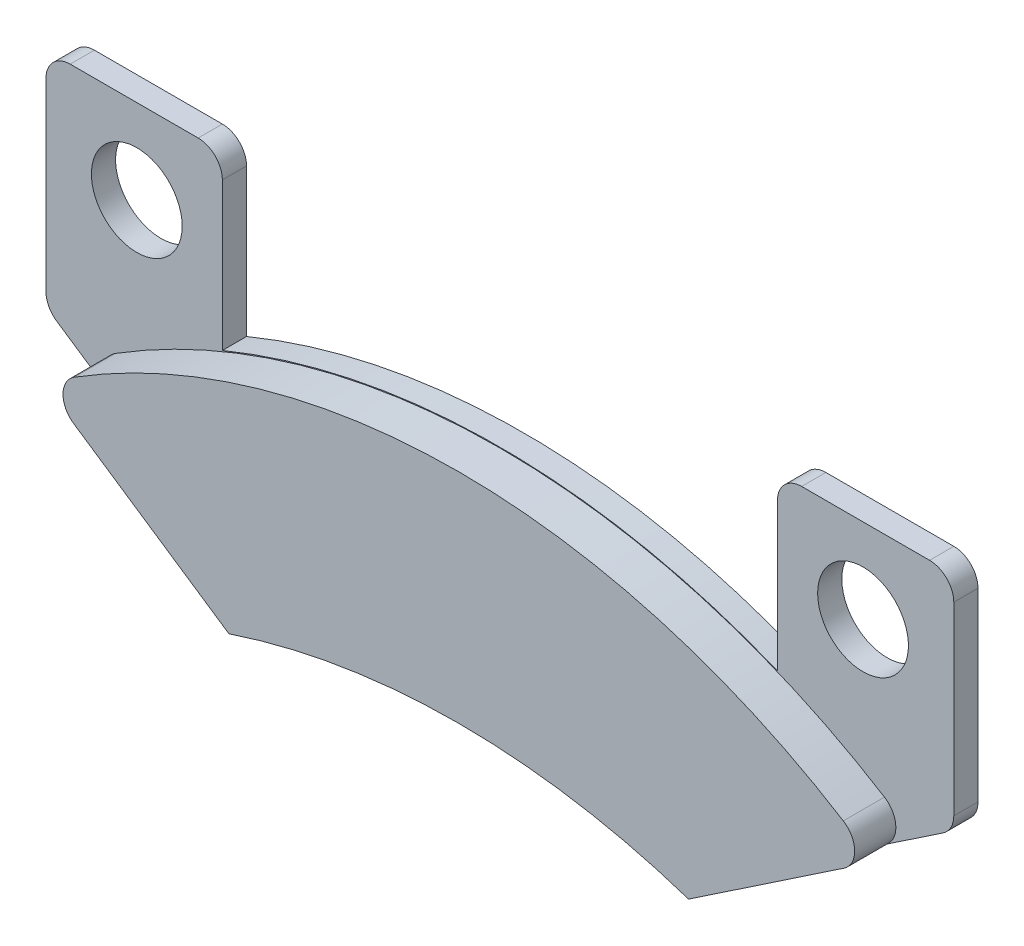
ISO-10303-21;
HEADER;
FILE_DESCRIPTION(('STEP AP214'),'2;1');
FILE_NAME('part.step','',(''),(''),'','','');
FILE_SCHEMA(('AUTOMOTIVE_DESIGN { 1 0 10303 214 1 1 1 1 }'));
ENDSEC;
DATA;
#1=APPLICATION_CONTEXT('core data for automotive mechanical design processes');
#2=APPLICATION_PROTOCOL_DEFINITION('international standard','automotive_design',2000,#1);
#3=PRODUCT_CONTEXT('',#1,'mechanical');
#4=PRODUCT('Part','Part','',(#3));
#5=PRODUCT_RELATED_PRODUCT_CATEGORY('part','',(#4));
#6=PRODUCT_DEFINITION_FORMATION('','',#4);
#7=PRODUCT_DEFINITION_CONTEXT('part definition',#1,'design');
#8=PRODUCT_DEFINITION('design','',#6,#7);
#9=PRODUCT_DEFINITION_SHAPE('','',#8);
#10=(LENGTH_UNIT() NAMED_UNIT(*) SI_UNIT(.MILLI.,.METRE.));
#11=(NAMED_UNIT(*) PLANE_ANGLE_UNIT() SI_UNIT($,.RADIAN.));
#12=(NAMED_UNIT(*) SI_UNIT($,.STERADIAN.) SOLID_ANGLE_UNIT());
#13=UNCERTAINTY_MEASURE_WITH_UNIT(LENGTH_MEASURE(1.E-05),#10,'distance_accuracy_value','');
#14=(GEOMETRIC_REPRESENTATION_CONTEXT(3) GLOBAL_UNCERTAINTY_ASSIGNED_CONTEXT((#13)) GLOBAL_UNIT_ASSIGNED_CONTEXT((#10,
#11,#12)) REPRESENTATION_CONTEXT('',''));
#15=CARTESIAN_POINT('',(0.,0.,0.));
#16=DIRECTION('',(0.,0.,1.));
#17=DIRECTION('',(1.,0.,0.));
#18=AXIS2_PLACEMENT_3D('',#15,#16,#17);
#19=CARTESIAN_POINT('',(0.,-94.4927219946583,2.54));
#20=DIRECTION('',(0.,0.,-1.));
#21=DIRECTION('',(-1.,0.,0.));
#22=AXIS2_PLACEMENT_3D('',#19,#20,#21);
#23=PLANE('',#22);
#24=DIRECTION('',(0.,-1.,0.));
#25=VECTOR('',#24,1.);
#26=CARTESIAN_POINT('',(-47.625,16.9068306510464,2.54));
#27=LINE('',#26,#25);
#28=CARTESIAN_POINT('',(-47.625,14.3668306510464,2.54));
#29=VERTEX_POINT('',#28);
#30=CARTESIAN_POINT('',(-47.625,-5.04907037389531,2.54));
#31=VERTEX_POINT('',#30);
#32=EDGE_CURVE('E247',#29,#31,#27,.T.);
#33=ORIENTED_EDGE('',*,*,#32,.T.);
#34=CARTESIAN_POINT('',(-45.085,-5.0490703738953,2.54));
#35=DIRECTION('',(0.,0.,-1.));
#36=DIRECTION('',(-1.,0.,0.));
#37=AXIS2_PLACEMENT_3D('',#34,#35,#36);
#38=CIRCLE('',#37,2.54);
#39=CARTESIAN_POINT('',(-46.5022287831688,-7.15692771635418,2.54));
#40=VERTEX_POINT('',#39);
#41=EDGE_CURVE('E326',#31,#40,#38,.F.);
#42=ORIENTED_EDGE('',*,*,#41,.T.);
#43=DIRECTION('',(0.829865095456248,-0.557964087861748,0.));
#44=VECTOR('',#43,1.);
#45=CARTESIAN_POINT('',(-47.625,-6.40202668327458,2.54));
#46=LINE('',#45,#44);
#47=CARTESIAN_POINT('',(-40.3987612097138,-11.2606256981861,2.54));
#48=VERTEX_POINT('',#47);
#49=EDGE_CURVE('E253',#40,#48,#46,.T.);
#50=ORIENTED_EDGE('',*,*,#49,.T.);
#51=CARTESIAN_POINT('',(-38.981532426545,-9.15276835572724,2.54));
#52=DIRECTION('',(0.,0.,-1.));
#53=DIRECTION('',(-1.,0.,0.));
#54=AXIS2_PLACEMENT_3D('',#51,#52,#53);
#55=CIRCLE('',#54,2.54);
#56=CARTESIAN_POINT('',(-40.3274691857839,-6.99868984273626,2.54));
#57=VERTEX_POINT('',#56);
#58=EDGE_CURVE('E52',#48,#57,#55,.T.);
#59=ORIENTED_EDGE('',*,*,#58,.T.);
#60=CARTESIAN_POINT('',(0.0262918410412195,-71.582087947867,2.54));
#61=DIRECTION('',(0.,0.,1.));
#62=DIRECTION('',(1.,0.,0.));
#63=AXIS2_PLACEMENT_3D('',#60,#61,#62);
#64=CIRCLE('',#63,76.1540631865163);
#65=CARTESIAN_POINT('',(40.3518507919903,-6.98107684812148,2.54));
#66=VERTEX_POINT('',#65);
#67=EDGE_CURVE('E217',#66,#57,#64,.T.);
#68=ORIENTED_EDGE('',*,*,#67,.F.);
#69=CARTESIAN_POINT('',(39.0068546690055,-9.13574281507682,2.54));
#70=DIRECTION('',(0.,0.,-1.));
#71=DIRECTION('',(-1.,0.,0.));
#72=AXIS2_PLACEMENT_3D('',#69,#70,#71);
#73=CIRCLE('',#72,2.54);
#74=CARTESIAN_POINT('',(40.4240834521743,-11.2436001575357,2.54));
#75=VERTEX_POINT('',#74);
#76=EDGE_CURVE('E11',#66,#75,#73,.T.);
#77=ORIENTED_EDGE('',*,*,#76,.T.);
#78=DIRECTION('',(0.829865095456248,0.557964087861748,0.));
#79=VECTOR('',#78,1.);
#80=CARTESIAN_POINT('',(47.625,-6.40202668327458,2.54));
#81=LINE('',#80,#79);
#82=CARTESIAN_POINT('',(46.5022287831688,-7.15692771635418,2.54));
#83=VERTEX_POINT('',#82);
#84=EDGE_CURVE('E251',#75,#83,#81,.T.);
#85=ORIENTED_EDGE('',*,*,#84,.T.);
#86=CARTESIAN_POINT('',(45.085,-5.04907037389531,2.54));
#87=DIRECTION('',(0.,0.,-1.));
#88=DIRECTION('',(-1.,0.,0.));
#89=AXIS2_PLACEMENT_3D('',#86,#87,#88);
#90=CIRCLE('',#89,2.54);
#91=CARTESIAN_POINT('',(47.625,-5.04907037389531,2.54));
#92=VERTEX_POINT('',#91);
#93=EDGE_CURVE('E321',#83,#92,#90,.F.);
#94=ORIENTED_EDGE('',*,*,#93,.T.);
#95=DIRECTION('',(0.,1.,0.));
#96=VECTOR('',#95,1.);
#97=CARTESIAN_POINT('',(47.625,16.9068306510464,2.54));
#98=LINE('',#97,#96);
#99=CARTESIAN_POINT('',(47.625,14.3668306510464,2.54));
#100=VERTEX_POINT('',#99);
#101=EDGE_CURVE('E232',#92,#100,#98,.T.);
#102=ORIENTED_EDGE('',*,*,#101,.T.);
#103=CARTESIAN_POINT('',(45.085,14.3668306510464,2.54));
#104=DIRECTION('',(0.,0.,-1.));
#105=DIRECTION('',(-1.,0.,0.));
#106=AXIS2_PLACEMENT_3D('',#103,#104,#105);
#107=CIRCLE('',#106,2.54);
#108=CARTESIAN_POINT('',(45.085,16.9068306510464,2.54));
#109=VERTEX_POINT('',#108);
#110=EDGE_CURVE('E320',#100,#109,#107,.F.);
#111=ORIENTED_EDGE('',*,*,#110,.T.);
#112=DIRECTION('',(-1.,0.,0.));
#113=VECTOR('',#112,1.);
#114=CARTESIAN_POINT('',(29.1207087068053,16.9068306510464,2.54));
#115=LINE('',#114,#113);
#116=CARTESIAN_POINT('',(31.6607087068053,16.9068306510464,2.54));
#117=VERTEX_POINT('',#116);
#118=EDGE_CURVE('E237',#109,#117,#115,.T.);
#119=ORIENTED_EDGE('',*,*,#118,.T.);
#120=CARTESIAN_POINT('',(31.6607087068053,14.3668306510464,2.54));
#121=DIRECTION('',(0.,0.,-1.));
#122=DIRECTION('',(-1.,0.,0.));
#123=AXIS2_PLACEMENT_3D('',#120,#121,#122);
#124=CIRCLE('',#123,2.54);
#125=CARTESIAN_POINT('',(29.1207087068053,14.3668306510464,2.54));
#126=VERTEX_POINT('',#125);
#127=EDGE_CURVE('E317',#117,#126,#124,.F.);
#128=ORIENTED_EDGE('',*,*,#127,.T.);
#129=DIRECTION('',(0.,-1.,0.));
#130=VECTOR('',#129,1.);
#131=CARTESIAN_POINT('',(29.1207087068053,-1.12833924845038,2.54));
#132=LINE('',#131,#130);
#133=CARTESIAN_POINT('',(29.1207087068053,-1.12833924845038,2.54));
#134=VERTEX_POINT('',#133);
#135=EDGE_CURVE('E238',#126,#134,#132,.T.);
#136=ORIENTED_EDGE('',*,*,#135,.T.);
#137=CARTESIAN_POINT('',(0.,-71.5444192615652,2.54));
#138=DIRECTION('',(0.,0.,1.));
#139=DIRECTION('',(1.,0.,0.));
#140=AXIS2_PLACEMENT_3D('',#137,#138,#139);
#141=CIRCLE('',#140,76.2);
#142=CARTESIAN_POINT('',(-29.1207087068053,-1.12833924845038,2.54));
#143=VERTEX_POINT('',#142);
#144=EDGE_CURVE('E245',#134,#143,#141,.T.);
#145=ORIENTED_EDGE('',*,*,#144,.T.);
#146=DIRECTION('',(0.,1.,0.));
#147=VECTOR('',#146,1.);
#148=CARTESIAN_POINT('',(-29.1207087068053,-1.12833924845038,2.54));
#149=LINE('',#148,#147);
#150=CARTESIAN_POINT('',(-29.1207087068053,14.3668306510464,2.54));
#151=VERTEX_POINT('',#150);
#152=EDGE_CURVE('E243',#143,#151,#149,.T.);
#153=ORIENTED_EDGE('',*,*,#152,.T.);
#154=CARTESIAN_POINT('',(-31.6607087068053,14.3668306510464,2.54));
#155=DIRECTION('',(0.,0.,-1.));
#156=DIRECTION('',(-1.,0.,0.));
#157=AXIS2_PLACEMENT_3D('',#154,#155,#156);
#158=CIRCLE('',#157,2.54);
#159=CARTESIAN_POINT('',(-31.6607087068053,16.9068306510464,2.54));
#160=VERTEX_POINT('',#159);
#161=EDGE_CURVE('E69',#151,#160,#158,.F.);
#162=ORIENTED_EDGE('',*,*,#161,.T.);
#163=DIRECTION('',(-1.,0.,0.));
#164=VECTOR('',#163,1.);
#165=CARTESIAN_POINT('',(-29.1207087068053,16.9068306510464,2.54));
#166=LINE('',#165,#164);
#167=CARTESIAN_POINT('',(-45.085,16.9068306510464,2.54));
#168=VERTEX_POINT('',#167);
#169=EDGE_CURVE('E248',#160,#168,#166,.T.);
#170=ORIENTED_EDGE('',*,*,#169,.T.);
#171=CARTESIAN_POINT('',(-45.085,14.3668306510464,2.54));
#172=DIRECTION('',(0.,0.,-1.));
#173=DIRECTION('',(-1.,0.,0.));
#174=AXIS2_PLACEMENT_3D('',#171,#172,#173);
#175=CIRCLE('',#174,2.54);
#176=EDGE_CURVE('E322',#168,#29,#175,.F.);
#177=ORIENTED_EDGE('',*,*,#176,.T.);
#178=EDGE_LOOP('',(#33,#42,#50,#59,#68,#77,#85,#94,#102,#111,#119,#128,#136,#145,#153,#162,#170,#177));
#179=FACE_BOUND('',#178,.T.);
#180=CARTESIAN_POINT('',(38.1,8.04801568355289,2.54));
#181=DIRECTION('',(0.,0.,1.));
#182=DIRECTION('',(-1.,0.,0.));
#183=AXIS2_PLACEMENT_3D('',#180,#181,#182);
#184=CIRCLE('',#183,4.7625);
#185=CARTESIAN_POINT('',(33.3375,8.04801568355289,2.54));
#186=VERTEX_POINT('',#185);
#187=EDGE_CURVE('E230',#186,#186,#184,.T.);
#188=ORIENTED_EDGE('',*,*,#187,.F.);
#189=EDGE_LOOP('',(#188));
#190=FACE_BOUND('',#189,.T.);
#191=CARTESIAN_POINT('',(-38.1,8.04801568355289,2.54));
#192=DIRECTION('',(0.,0.,1.));
#193=DIRECTION('',(1.,0.,0.));
#194=AXIS2_PLACEMENT_3D('',#191,#192,#193);
#195=CIRCLE('',#194,4.7625);
#196=CARTESIAN_POINT('',(-33.3375,8.04801568355289,2.54));
#197=VERTEX_POINT('',#196);
#198=EDGE_CURVE('E222',#197,#197,#195,.T.);
#199=ORIENTED_EDGE('',*,*,#198,.F.);
#200=EDGE_LOOP('',(#199));
#201=FACE_BOUND('',#200,.T.);
#202=ADVANCED_FACE('F44',(#179,#190,#201),#23,.F.);
#203=CARTESIAN_POINT('',(0.,-94.4927219946583,0.));
#204=DIRECTION('',(0.,0.,-1.));
#205=DIRECTION('',(-1.,0.,0.));
#206=AXIS2_PLACEMENT_3D('',#203,#204,#205);
#207=PLANE('',#206);
#208=CARTESIAN_POINT('',(38.1,8.04801568355289,0.));
#209=DIRECTION('',(0.,0.,1.));
#210=DIRECTION('',(-1.,0.,0.));
#211=AXIS2_PLACEMENT_3D('',#208,#209,#210);
#212=CIRCLE('',#211,4.7625);
#213=CARTESIAN_POINT('',(33.3375,8.04801568355289,0.));
#214=VERTEX_POINT('',#213);
#215=EDGE_CURVE('E221',#214,#214,#212,.T.);
#216=ORIENTED_EDGE('',*,*,#215,.T.);
#217=EDGE_LOOP('',(#216));
#218=FACE_BOUND('',#217,.T.);
#219=DIRECTION('',(0.829865095456248,-0.557964087861748,0.));
#220=VECTOR('',#219,1.);
#221=CARTESIAN_POINT('',(-47.625,-6.40202668327458,0.));
#222=LINE('',#221,#220);
#223=CARTESIAN_POINT('',(-46.5022287831688,-7.15692771635418,0.));
#224=VERTEX_POINT('',#223);
#225=CARTESIAN_POINT('',(-24.1148920154256,-22.2091693489536,0.));
#226=VERTEX_POINT('',#225);
#227=EDGE_CURVE('E204',#224,#226,#222,.T.);
#228=ORIENTED_EDGE('',*,*,#227,.F.);
#229=CARTESIAN_POINT('',(-45.085,-5.0490703738953,0.));
#230=DIRECTION('',(0.,0.,-1.));
#231=DIRECTION('',(-1.,0.,0.));
#232=AXIS2_PLACEMENT_3D('',#229,#230,#231);
#233=CIRCLE('',#232,2.54);
#234=CARTESIAN_POINT('',(-47.625,-5.04907037389531,0.));
#235=VERTEX_POINT('',#234);
#236=EDGE_CURVE('E309',#224,#235,#233,.T.);
#237=ORIENTED_EDGE('',*,*,#236,.T.);
#238=DIRECTION('',(0.,-1.,0.));
#239=VECTOR('',#238,1.);
#240=CARTESIAN_POINT('',(-47.625,16.9068306510464,0.));
#241=LINE('',#240,#239);
#242=CARTESIAN_POINT('',(-47.625,14.3668306510464,0.));
#243=VERTEX_POINT('',#242);
#244=EDGE_CURVE('E269',#243,#235,#241,.T.);
#245=ORIENTED_EDGE('',*,*,#244,.F.);
#246=CARTESIAN_POINT('',(-45.085,14.3668306510464,0.));
#247=DIRECTION('',(0.,0.,-1.));
#248=DIRECTION('',(-1.,0.,0.));
#249=AXIS2_PLACEMENT_3D('',#246,#247,#248);
#250=CIRCLE('',#249,2.54);
#251=CARTESIAN_POINT('',(-45.085,16.9068306510464,0.));
#252=VERTEX_POINT('',#251);
#253=EDGE_CURVE('E306',#243,#252,#250,.T.);
#254=ORIENTED_EDGE('',*,*,#253,.T.);
#255=DIRECTION('',(-1.,0.,0.));
#256=VECTOR('',#255,1.);
#257=CARTESIAN_POINT('',(-29.1207087068053,16.9068306510464,0.));
#258=LINE('',#257,#256);
#259=CARTESIAN_POINT('',(-31.6607087068053,16.9068306510464,0.));
#260=VERTEX_POINT('',#259);
#261=EDGE_CURVE('E268',#260,#252,#258,.T.);
#262=ORIENTED_EDGE('',*,*,#261,.F.);
#263=CARTESIAN_POINT('',(-31.6607087068053,14.3668306510464,0.));
#264=DIRECTION('',(0.,0.,-1.));
#265=DIRECTION('',(-1.,0.,0.));
#266=AXIS2_PLACEMENT_3D('',#263,#264,#265);
#267=CIRCLE('',#266,2.54);
#268=CARTESIAN_POINT('',(-29.1207087068053,14.3668306510464,0.));
#269=VERTEX_POINT('',#268);
#270=EDGE_CURVE('E308',#260,#269,#267,.T.);
#271=ORIENTED_EDGE('',*,*,#270,.T.);
#272=DIRECTION('',(0.,1.,0.));
#273=VECTOR('',#272,1.);
#274=CARTESIAN_POINT('',(-29.1207087068053,-1.12833924845038,0.));
#275=LINE('',#274,#273);
#276=CARTESIAN_POINT('',(-29.1207087068053,-1.12833924845038,0.));
#277=VERTEX_POINT('',#276);
#278=EDGE_CURVE('E264',#277,#269,#275,.T.);
#279=ORIENTED_EDGE('',*,*,#278,.F.);
#280=CARTESIAN_POINT('',(0.,-71.5444192615652,0.));
#281=DIRECTION('',(0.,0.,1.));
#282=DIRECTION('',(1.,0.,0.));
#283=AXIS2_PLACEMENT_3D('',#280,#281,#282);
#284=CIRCLE('',#283,76.2);
#285=CARTESIAN_POINT('',(29.1207087068053,-1.12833924845038,0.));
#286=VERTEX_POINT('',#285);
#287=EDGE_CURVE('E263',#286,#277,#284,.T.);
#288=ORIENTED_EDGE('',*,*,#287,.F.);
#289=DIRECTION('',(0.,-1.,0.));
#290=VECTOR('',#289,1.);
#291=CARTESIAN_POINT('',(29.1207087068053,-1.12833924845038,0.));
#292=LINE('',#291,#290);
#293=CARTESIAN_POINT('',(29.1207087068053,14.3668306510464,0.));
#294=VERTEX_POINT('',#293);
#295=EDGE_CURVE('E261',#294,#286,#292,.T.);
#296=ORIENTED_EDGE('',*,*,#295,.F.);
#297=CARTESIAN_POINT('',(31.6607087068053,14.3668306510464,0.));
#298=DIRECTION('',(0.,0.,-1.));
#299=DIRECTION('',(-1.,0.,0.));
#300=AXIS2_PLACEMENT_3D('',#297,#298,#299);
#301=CIRCLE('',#300,2.54);
#302=CARTESIAN_POINT('',(31.6607087068053,16.9068306510464,0.));
#303=VERTEX_POINT('',#302);
#304=EDGE_CURVE('E304',#294,#303,#301,.T.);
#305=ORIENTED_EDGE('',*,*,#304,.T.);
#306=DIRECTION('',(-1.,0.,0.));
#307=VECTOR('',#306,1.);
#308=CARTESIAN_POINT('',(29.1207087068053,16.9068306510464,0.));
#309=LINE('',#308,#307);
#310=CARTESIAN_POINT('',(45.085,16.9068306510464,0.));
#311=VERTEX_POINT('',#310);
#312=EDGE_CURVE('E256',#311,#303,#309,.T.);
#313=ORIENTED_EDGE('',*,*,#312,.F.);
#314=CARTESIAN_POINT('',(45.085,14.3668306510464,0.));
#315=DIRECTION('',(0.,0.,-1.));
#316=DIRECTION('',(-1.,0.,0.));
#317=AXIS2_PLACEMENT_3D('',#314,#315,#316);
#318=CIRCLE('',#317,2.54);
#319=CARTESIAN_POINT('',(47.625,14.3668306510464,0.));
#320=VERTEX_POINT('',#319);
#321=EDGE_CURVE('E299',#311,#320,#318,.T.);
#322=ORIENTED_EDGE('',*,*,#321,.T.);
#323=DIRECTION('',(0.,1.,0.));
#324=VECTOR('',#323,1.);
#325=CARTESIAN_POINT('',(47.625,16.9068306510464,0.));
#326=LINE('',#325,#324);
#327=CARTESIAN_POINT('',(47.625,-5.04907037389531,0.));
#328=VERTEX_POINT('',#327);
#329=EDGE_CURVE('E229',#328,#320,#326,.T.);
#330=ORIENTED_EDGE('',*,*,#329,.F.);
#331=CARTESIAN_POINT('',(45.085,-5.04907037389531,0.));
#332=DIRECTION('',(0.,0.,-1.));
#333=DIRECTION('',(-1.,0.,0.));
#334=AXIS2_PLACEMENT_3D('',#331,#332,#333);
#335=CIRCLE('',#334,2.54);
#336=CARTESIAN_POINT('',(46.5022287831688,-7.15692771635418,0.));
#337=VERTEX_POINT('',#336);
#338=EDGE_CURVE('E305',#328,#337,#335,.T.);
#339=ORIENTED_EDGE('',*,*,#338,.T.);
#340=DIRECTION('',(0.829865095456248,0.557964087861748,0.));
#341=VECTOR('',#340,1.);
#342=CARTESIAN_POINT('',(47.625,-6.40202668327458,0.));
#343=LINE('',#342,#341);
#344=CARTESIAN_POINT('',(24.1148920154256,-22.2091693489536,0.));
#345=VERTEX_POINT('',#344);
#346=EDGE_CURVE('E240',#345,#337,#343,.T.);
#347=ORIENTED_EDGE('',*,*,#346,.F.);
#348=CARTESIAN_POINT('',(0.,-94.4927219946583,0.));
#349=DIRECTION('',(0.,0.,-1.));
#350=DIRECTION('',(-1.,0.,0.));
#351=AXIS2_PLACEMENT_3D('',#348,#349,#350);
#352=CIRCLE('',#351,76.2);
#353=EDGE_CURVE('E273',#226,#345,#352,.T.);
#354=ORIENTED_EDGE('',*,*,#353,.F.);
#355=EDGE_LOOP('',(#228,#237,#245,#254,#262,#271,#279,#288,#296,#305,#313,#322,#330,#339,#347,#354));
#356=FACE_BOUND('',#355,.T.);
#357=CARTESIAN_POINT('',(-38.1,8.04801568355289,0.));
#358=DIRECTION('',(0.,0.,1.));
#359=DIRECTION('',(1.,0.,0.));
#360=AXIS2_PLACEMENT_3D('',#357,#358,#359);
#361=CIRCLE('',#360,4.7625);
#362=CARTESIAN_POINT('',(-33.3375,8.04801568355289,0.));
#363=VERTEX_POINT('',#362);
#364=EDGE_CURVE('E212',#363,#363,#361,.T.);
#365=ORIENTED_EDGE('',*,*,#364,.T.);
#366=EDGE_LOOP('',(#365));
#367=FACE_BOUND('',#366,.T.);
#368=ADVANCED_FACE('F365',(#218,#356,#367),#207,.T.);
#369=CARTESIAN_POINT('',(47.625,16.9068306510464,2.54));
#370=DIRECTION('',(-1.,0.,0.));
#371=DIRECTION('',(0.,0.,1.));
#372=AXIS2_PLACEMENT_3D('',#369,#370,#371);
#373=PLANE('',#372);
#374=ORIENTED_EDGE('',*,*,#101,.F.);
#375=DIRECTION('',(0.,0.,-1.));
#376=VECTOR('',#375,1.);
#377=CARTESIAN_POINT('',(47.625,-5.04907037389531,2.54));
#378=LINE('',#377,#376);
#379=EDGE_CURVE('E336',#92,#328,#378,.T.);
#380=ORIENTED_EDGE('',*,*,#379,.T.);
#381=ORIENTED_EDGE('',*,*,#329,.T.);
#382=DIRECTION('',(0.,0.,-1.));
#383=VECTOR('',#382,1.);
#384=CARTESIAN_POINT('',(47.625,14.3668306510464,2.54));
#385=LINE('',#384,#383);
#386=EDGE_CURVE('E331',#320,#100,#385,.F.);
#387=ORIENTED_EDGE('',*,*,#386,.T.);
#388=EDGE_LOOP('',(#374,#380,#381,#387));
#389=FACE_BOUND('',#388,.T.);
#390=ADVANCED_FACE('F408',(#389),#373,.F.);
#391=CARTESIAN_POINT('',(29.1207087068053,16.9068306510464,2.54));
#392=DIRECTION('',(0.,-1.,0.));
#393=DIRECTION('',(1.,0.,0.));
#394=AXIS2_PLACEMENT_3D('',#391,#392,#393);
#395=PLANE('',#394);
#396=ORIENTED_EDGE('',*,*,#312,.T.);
#397=DIRECTION('',(0.,0.,-1.));
#398=VECTOR('',#397,1.);
#399=CARTESIAN_POINT('',(31.6607087068053,16.9068306510464,2.54));
#400=LINE('',#399,#398);
#401=EDGE_CURVE('E341',#303,#117,#400,.F.);
#402=ORIENTED_EDGE('',*,*,#401,.T.);
#403=ORIENTED_EDGE('',*,*,#118,.F.);
#404=DIRECTION('',(0.,0.,-1.));
#405=VECTOR('',#404,1.);
#406=CARTESIAN_POINT('',(45.085,16.9068306510464,2.54));
#407=LINE('',#406,#405);
#408=EDGE_CURVE('E344',#109,#311,#407,.T.);
#409=ORIENTED_EDGE('',*,*,#408,.T.);
#410=EDGE_LOOP('',(#396,#402,#403,#409));
#411=FACE_BOUND('',#410,.T.);
#412=ADVANCED_FACE('F402',(#411),#395,.F.);
#413=CARTESIAN_POINT('',(29.1207087068053,-1.12833924845038,2.54));
#414=DIRECTION('',(1.,0.,0.));
#415=DIRECTION('',(0.,0.,-1.));
#416=AXIS2_PLACEMENT_3D('',#413,#414,#415);
#417=PLANE('',#416);
#418=ORIENTED_EDGE('',*,*,#135,.F.);
#419=DIRECTION('',(0.,0.,-1.));
#420=VECTOR('',#419,1.);
#421=CARTESIAN_POINT('',(29.1207087068053,14.3668306510464,2.54));
#422=LINE('',#421,#420);
#423=EDGE_CURVE('E338',#126,#294,#422,.T.);
#424=ORIENTED_EDGE('',*,*,#423,.T.);
#425=ORIENTED_EDGE('',*,*,#295,.T.);
#426=DIRECTION('',(0.,0.,-1.));
#427=VECTOR('',#426,1.);
#428=CARTESIAN_POINT('',(29.1207087068053,-1.12833924845038,2.54));
#429=LINE('',#428,#427);
#430=EDGE_CURVE('E281',#134,#286,#429,.T.);
#431=ORIENTED_EDGE('',*,*,#430,.F.);
#432=EDGE_LOOP('',(#418,#424,#425,#431));
#433=FACE_BOUND('',#432,.T.);
#434=ADVANCED_FACE('F392',(#433),#417,.F.);
#435=CARTESIAN_POINT('',(0.,-71.5444192615652,2.54));
#436=DIRECTION('',(0.,0.,-1.));
#437=DIRECTION('',(-1.,0.,0.));
#438=AXIS2_PLACEMENT_3D('',#435,#436,#437);
#439=CYLINDRICAL_SURFACE('',#438,76.2);
#440=ORIENTED_EDGE('',*,*,#287,.T.);
#441=DIRECTION('',(0.,0.,-1.));
#442=VECTOR('',#441,1.);
#443=CARTESIAN_POINT('',(-29.1207087068053,-1.12833924845038,2.54));
#444=LINE('',#443,#442);
#445=EDGE_CURVE('E210',#143,#277,#444,.T.);
#446=ORIENTED_EDGE('',*,*,#445,.F.);
#447=ORIENTED_EDGE('',*,*,#144,.F.);
#448=ORIENTED_EDGE('',*,*,#430,.T.);
#449=EDGE_LOOP('',(#440,#446,#447,#448));
#450=FACE_BOUND('',#449,.T.);
#451=ADVANCED_FACE('F390',(#450),#439,.T.);
#452=CARTESIAN_POINT('',(-29.1207087068053,-1.12833924845038,2.54));
#453=DIRECTION('',(-1.,0.,0.));
#454=DIRECTION('',(0.,0.,1.));
#455=AXIS2_PLACEMENT_3D('',#452,#453,#454);
#456=PLANE('',#455);
#457=ORIENTED_EDGE('',*,*,#278,.T.);
#458=DIRECTION('',(0.,0.,-1.));
#459=VECTOR('',#458,1.);
#460=CARTESIAN_POINT('',(-29.1207087068053,14.3668306510464,2.54));
#461=LINE('',#460,#459);
#462=EDGE_CURVE('E335',#269,#151,#461,.F.);
#463=ORIENTED_EDGE('',*,*,#462,.T.);
#464=ORIENTED_EDGE('',*,*,#152,.F.);
#465=ORIENTED_EDGE('',*,*,#445,.T.);
#466=EDGE_LOOP('',(#457,#463,#464,#465));
#467=FACE_BOUND('',#466,.T.);
#468=ADVANCED_FACE('F385',(#467),#456,.F.);
#469=CARTESIAN_POINT('',(-29.1207087068053,16.9068306510464,2.54));
#470=DIRECTION('',(0.,-1.,0.));
#471=DIRECTION('',(1.,0.,0.));
#472=AXIS2_PLACEMENT_3D('',#469,#470,#471);
#473=PLANE('',#472);
#474=ORIENTED_EDGE('',*,*,#261,.T.);
#475=DIRECTION('',(0.,0.,-1.));
#476=VECTOR('',#475,1.);
#477=CARTESIAN_POINT('',(-45.085,16.9068306510464,2.54));
#478=LINE('',#477,#476);
#479=EDGE_CURVE('E58',#252,#168,#478,.F.);
#480=ORIENTED_EDGE('',*,*,#479,.T.);
#481=ORIENTED_EDGE('',*,*,#169,.F.);
#482=DIRECTION('',(0.,0.,-1.));
#483=VECTOR('',#482,1.);
#484=CARTESIAN_POINT('',(-31.6607087068053,16.9068306510464,2.54));
#485=LINE('',#484,#483);
#486=EDGE_CURVE('E327',#160,#260,#485,.T.);
#487=ORIENTED_EDGE('',*,*,#486,.T.);
#488=EDGE_LOOP('',(#474,#480,#481,#487));
#489=FACE_BOUND('',#488,.T.);
#490=ADVANCED_FACE('F372',(#489),#473,.F.);
#491=CARTESIAN_POINT('',(-47.625,16.9068306510464,2.54));
#492=DIRECTION('',(1.,0.,0.));
#493=DIRECTION('',(0.,0.,-1.));
#494=AXIS2_PLACEMENT_3D('',#491,#492,#493);
#495=PLANE('',#494);
#496=ORIENTED_EDGE('',*,*,#244,.T.);
#497=DIRECTION('',(0.,0.,-1.));
#498=VECTOR('',#497,1.);
#499=CARTESIAN_POINT('',(-47.625,-5.04907037389531,2.54));
#500=LINE('',#499,#498);
#501=EDGE_CURVE('E312',#235,#31,#500,.F.);
#502=ORIENTED_EDGE('',*,*,#501,.T.);
#503=ORIENTED_EDGE('',*,*,#32,.F.);
#504=DIRECTION('',(0.,0.,-1.));
#505=VECTOR('',#504,1.);
#506=CARTESIAN_POINT('',(-47.625,14.3668306510464,2.54));
#507=LINE('',#506,#505);
#508=EDGE_CURVE('E315',#29,#243,#507,.T.);
#509=ORIENTED_EDGE('',*,*,#508,.T.);
#510=EDGE_LOOP('',(#496,#502,#503,#509));
#511=FACE_BOUND('',#510,.T.);
#512=ADVANCED_FACE('F370',(#511),#495,.F.);
#513=CARTESIAN_POINT('',(-47.625,-6.40202668327458,2.54));
#514=DIRECTION('',(0.557964087861747,0.829865095456248,0.));
#515=DIRECTION('',(-0.829865095456248,0.557964087861747,0.));
#516=AXIS2_PLACEMENT_3D('',#513,#514,#515);
#517=PLANE('',#516);
#518=DIRECTION('',(0.829865095456248,-0.557964087861747,0.));
#519=VECTOR('',#518,1.);
#520=CARTESIAN_POINT('',(-43.5603301316157,-9.13492848621798,6.858));
#521=LINE('',#520,#519);
#522=CARTESIAN_POINT('',(-40.3987612097138,-11.2606256981861,6.858));
#523=VERTEX_POINT('',#522);
#524=CARTESIAN_POINT('',(-24.1148920154256,-22.2091693489536,6.858));
#525=VERTEX_POINT('',#524);
#526=EDGE_CURVE('E184',#523,#525,#521,.T.);
#527=ORIENTED_EDGE('',*,*,#526,.F.);
#528=DIRECTION('',(0.,0.,-1.));
#529=VECTOR('',#528,1.);
#530=CARTESIAN_POINT('',(-40.3987612097138,-11.2606256981861,2.54));
#531=LINE('',#530,#529);
#532=EDGE_CURVE('E288',#523,#48,#531,.T.);
#533=ORIENTED_EDGE('',*,*,#532,.T.);
#534=ORIENTED_EDGE('',*,*,#49,.F.);
#535=DIRECTION('',(0.,0.,-1.));
#536=VECTOR('',#535,1.);
#537=CARTESIAN_POINT('',(-46.5022287831688,-7.15692771635418,2.54));
#538=LINE('',#537,#536);
#539=EDGE_CURVE('E283',#40,#224,#538,.T.);
#540=ORIENTED_EDGE('',*,*,#539,.T.);
#541=ORIENTED_EDGE('',*,*,#227,.T.);
#542=DIRECTION('',(0.,0.,-1.));
#543=VECTOR('',#542,1.);
#544=CARTESIAN_POINT('',(-24.1148920154256,-22.2091693489536,2.54));
#545=LINE('',#544,#543);
#546=EDGE_CURVE('E199',#525,#226,#545,.T.);
#547=ORIENTED_EDGE('',*,*,#546,.F.);
#548=EDGE_LOOP('',(#527,#533,#534,#540,#541,#547));
#549=FACE_BOUND('',#548,.T.);
#550=ADVANCED_FACE('F203',(#549),#517,.F.);
#551=CARTESIAN_POINT('',(0.,-94.4927219946583,2.54));
#552=DIRECTION('',(0.,0.,-1.));
#553=DIRECTION('',(-1.,0.,0.));
#554=AXIS2_PLACEMENT_3D('',#551,#552,#553);
#555=CYLINDRICAL_SURFACE('',#554,76.2);
#556=ORIENTED_EDGE('',*,*,#353,.T.);
#557=DIRECTION('',(0.,0.,-1.));
#558=VECTOR('',#557,1.);
#559=CARTESIAN_POINT('',(24.1148920154256,-22.2091693489536,2.54));
#560=LINE('',#559,#558);
#561=CARTESIAN_POINT('',(24.1148920154256,-22.2091693489536,6.858));
#562=VERTEX_POINT('',#561);
#563=EDGE_CURVE('E208',#562,#345,#560,.T.);
#564=ORIENTED_EDGE('',*,*,#563,.F.);
#565=CARTESIAN_POINT('',(0.,-94.4927219946583,6.858));
#566=DIRECTION('',(0.,0.,-1.));
#567=DIRECTION('',(1.,0.,0.));
#568=AXIS2_PLACEMENT_3D('',#565,#566,#567);
#569=CIRCLE('',#568,76.2);
#570=EDGE_CURVE('E189',#525,#562,#569,.T.);
#571=ORIENTED_EDGE('',*,*,#570,.F.);
#572=ORIENTED_EDGE('',*,*,#546,.T.);
#573=EDGE_LOOP('',(#556,#564,#571,#572));
#574=FACE_BOUND('',#573,.T.);
#575=ADVANCED_FACE('F209',(#574),#555,.F.);
#576=CARTESIAN_POINT('',(47.625,-6.40202668327458,2.54));
#577=DIRECTION('',(-0.557964087861747,0.829865095456248,0.));
#578=DIRECTION('',(-0.829865095456248,-0.557964087861747,0.));
#579=AXIS2_PLACEMENT_3D('',#576,#577,#578);
#580=PLANE('',#579);
#581=ORIENTED_EDGE('',*,*,#84,.F.);
#582=DIRECTION('',(0.,0.,-1.));
#583=VECTOR('',#582,1.);
#584=CARTESIAN_POINT('',(40.4240834521743,-11.2436001575357,2.54));
#585=LINE('',#584,#583);
#586=CARTESIAN_POINT('',(40.4240834521743,-11.2436001575357,6.858));
#587=VERTEX_POINT('',#586);
#588=EDGE_CURVE('E297',#75,#587,#585,.F.);
#589=ORIENTED_EDGE('',*,*,#588,.T.);
#590=DIRECTION('',(0.829865095456248,0.557964087861748,0.));
#591=VECTOR('',#590,1.);
#592=CARTESIAN_POINT('',(24.1148920154256,-22.2091693489536,6.858));
#593=LINE('',#592,#591);
#594=EDGE_CURVE('E215',#562,#587,#593,.T.);
#595=ORIENTED_EDGE('',*,*,#594,.F.);
#596=ORIENTED_EDGE('',*,*,#563,.T.);
#597=ORIENTED_EDGE('',*,*,#346,.T.);
#598=DIRECTION('',(0.,0.,-1.));
#599=VECTOR('',#598,1.);
#600=CARTESIAN_POINT('',(46.5022287831688,-7.15692771635418,2.54));
#601=LINE('',#600,#599);
#602=EDGE_CURVE('E296',#337,#83,#601,.F.);
#603=ORIENTED_EDGE('',*,*,#602,.T.);
#604=EDGE_LOOP('',(#581,#589,#595,#596,#597,#603));
#605=FACE_BOUND('',#604,.T.);
#606=ADVANCED_FACE('F417',(#605),#580,.F.);
#607=CARTESIAN_POINT('',(38.1,8.04801568355289,2.54));
#608=DIRECTION('',(0.,0.,-1.));
#609=DIRECTION('',(-1.,0.,0.));
#610=AXIS2_PLACEMENT_3D('',#607,#608,#609);
#611=CYLINDRICAL_SURFACE('',#610,4.7625);
#612=ORIENTED_EDGE('',*,*,#187,.T.);
#613=EDGE_LOOP('',(#612));
#614=FACE_BOUND('',#613,.T.);
#615=ORIENTED_EDGE('',*,*,#215,.F.);
#616=EDGE_LOOP('',(#615));
#617=FACE_BOUND('',#616,.T.);
#618=ADVANCED_FACE('F438',(#614,#617),#611,.F.);
#619=CARTESIAN_POINT('',(-38.1,8.04801568355289,2.54));
#620=DIRECTION('',(0.,0.,-1.));
#621=DIRECTION('',(-1.,0.,0.));
#622=AXIS2_PLACEMENT_3D('',#619,#620,#621);
#623=CYLINDRICAL_SURFACE('',#622,4.7625);
#624=ORIENTED_EDGE('',*,*,#198,.T.);
#625=EDGE_LOOP('',(#624));
#626=FACE_BOUND('',#625,.T.);
#627=ORIENTED_EDGE('',*,*,#364,.F.);
#628=EDGE_LOOP('',(#627));
#629=FACE_BOUND('',#628,.T.);
#630=ADVANCED_FACE('F510',(#626,#629),#623,.F.);
#631=CARTESIAN_POINT('',(0.0262918410412195,-71.582087947867,6.858));
#632=DIRECTION('',(0.,0.,-1.));
#633=DIRECTION('',(-1.,0.,0.));
#634=AXIS2_PLACEMENT_3D('',#631,#632,#633);
#635=CYLINDRICAL_SURFACE('',#634,76.1540631865163);
#636=ORIENTED_EDGE('',*,*,#67,.T.);
#637=DIRECTION('',(0.,0.,-1.));
#638=VECTOR('',#637,1.);
#639=CARTESIAN_POINT('',(-40.3274691857839,-6.99868984273626,6.858));
#640=LINE('',#639,#638);
#641=CARTESIAN_POINT('',(-40.3274691857839,-6.99868984273626,6.858));
#642=VERTEX_POINT('',#641);
#643=EDGE_CURVE('E292',#57,#642,#640,.F.);
#644=ORIENTED_EDGE('',*,*,#643,.T.);
#645=CARTESIAN_POINT('',(0.0262918410412195,-71.582087947867,6.858));
#646=DIRECTION('',(0.,0.,1.));
#647=DIRECTION('',(1.,0.,0.));
#648=AXIS2_PLACEMENT_3D('',#645,#646,#647);
#649=CIRCLE('',#648,76.1540631865163);
#650=CARTESIAN_POINT('',(40.3518507919903,-6.98107684812148,6.858));
#651=VERTEX_POINT('',#650);
#652=EDGE_CURVE('E197',#651,#642,#649,.T.);
#653=ORIENTED_EDGE('',*,*,#652,.F.);
#654=DIRECTION('',(0.,0.,-1.));
#655=VECTOR('',#654,1.);
#656=CARTESIAN_POINT('',(40.3518507919904,-6.98107684812146,6.858));
#657=LINE('',#656,#655);
#658=EDGE_CURVE('E287',#651,#66,#657,.T.);
#659=ORIENTED_EDGE('',*,*,#658,.T.);
#660=EDGE_LOOP('',(#636,#644,#653,#659));
#661=FACE_BOUND('',#660,.T.);
#662=ADVANCED_FACE('F352',(#661),#635,.T.);
#663=CARTESIAN_POINT('',(0.0262918410412195,-71.582087947867,6.858));
#664=DIRECTION('',(0.,0.,1.));
#665=DIRECTION('',(1.,0.,0.));
#666=AXIS2_PLACEMENT_3D('',#663,#664,#665);
#667=PLANE('',#666);
#668=ORIENTED_EDGE('',*,*,#652,.T.);
#669=CARTESIAN_POINT('',(-38.981532426545,-9.15276835572724,6.858));
#670=DIRECTION('',(0.,0.,1.));
#671=DIRECTION('',(1.,0.,0.));
#672=AXIS2_PLACEMENT_3D('',#669,#670,#671);
#673=CIRCLE('',#672,2.54);
#674=EDGE_CURVE('E192',#642,#523,#673,.T.);
#675=ORIENTED_EDGE('',*,*,#674,.T.);
#676=ORIENTED_EDGE('',*,*,#526,.T.);
#677=ORIENTED_EDGE('',*,*,#570,.T.);
#678=ORIENTED_EDGE('',*,*,#594,.T.);
#679=CARTESIAN_POINT('',(39.0068546690055,-9.13574281507682,6.858));
#680=DIRECTION('',(0.,0.,1.));
#681=DIRECTION('',(1.,0.,0.));
#682=AXIS2_PLACEMENT_3D('',#679,#680,#681);
#683=CIRCLE('',#682,2.54);
#684=EDGE_CURVE('E291',#587,#651,#683,.T.);
#685=ORIENTED_EDGE('',*,*,#684,.T.);
#686=EDGE_LOOP('',(#668,#675,#676,#677,#678,#685));
#687=FACE_BOUND('',#686,.T.);
#688=ADVANCED_FACE('F190',(#687),#667,.T.);
#689=CARTESIAN_POINT('',(-38.981532426545,-9.15276835572724,6.858));
#690=DIRECTION('',(0.,0.,-1.));
#691=DIRECTION('',(-1.,0.,0.));
#692=AXIS2_PLACEMENT_3D('',#689,#690,#691);
#693=CYLINDRICAL_SURFACE('',#692,2.54);
#694=ORIENTED_EDGE('',*,*,#674,.F.);
#695=ORIENTED_EDGE('',*,*,#643,.F.);
#696=ORIENTED_EDGE('',*,*,#58,.F.);
#697=ORIENTED_EDGE('',*,*,#532,.F.);
#698=EDGE_LOOP('',(#694,#695,#696,#697));
#699=FACE_BOUND('',#698,.T.);
#700=ADVANCED_FACE('F358',(#699),#693,.T.);
#701=CARTESIAN_POINT('',(39.0068546690055,-9.13574281507682,6.858));
#702=DIRECTION('',(0.,0.,-1.));
#703=DIRECTION('',(-1.,0.,0.));
#704=AXIS2_PLACEMENT_3D('',#701,#702,#703);
#705=CYLINDRICAL_SURFACE('',#704,2.54);
#706=ORIENTED_EDGE('',*,*,#684,.F.);
#707=ORIENTED_EDGE('',*,*,#588,.F.);
#708=ORIENTED_EDGE('',*,*,#76,.F.);
#709=ORIENTED_EDGE('',*,*,#658,.F.);
#710=EDGE_LOOP('',(#706,#707,#708,#709));
#711=FACE_BOUND('',#710,.T.);
#712=ADVANCED_FACE('F423',(#711),#705,.T.);
#713=CARTESIAN_POINT('',(-45.085,-5.0490703738953,2.54));
#714=DIRECTION('',(0.,0.,-1.));
#715=DIRECTION('',(-1.,0.,0.));
#716=AXIS2_PLACEMENT_3D('',#713,#714,#715);
#717=CYLINDRICAL_SURFACE('',#716,2.54);
#718=ORIENTED_EDGE('',*,*,#41,.F.);
#719=ORIENTED_EDGE('',*,*,#501,.F.);
#720=ORIENTED_EDGE('',*,*,#236,.F.);
#721=ORIENTED_EDGE('',*,*,#539,.F.);
#722=EDGE_LOOP('',(#718,#719,#720,#721));
#723=FACE_BOUND('',#722,.T.);
#724=ADVANCED_FACE('F356',(#723),#717,.T.);
#725=CARTESIAN_POINT('',(-45.085,14.3668306510464,2.54));
#726=DIRECTION('',(0.,0.,-1.));
#727=DIRECTION('',(-1.,0.,0.));
#728=AXIS2_PLACEMENT_3D('',#725,#726,#727);
#729=CYLINDRICAL_SURFACE('',#728,2.54);
#730=ORIENTED_EDGE('',*,*,#176,.F.);
#731=ORIENTED_EDGE('',*,*,#479,.F.);
#732=ORIENTED_EDGE('',*,*,#253,.F.);
#733=ORIENTED_EDGE('',*,*,#508,.F.);
#734=EDGE_LOOP('',(#730,#731,#732,#733));
#735=FACE_BOUND('',#734,.T.);
#736=ADVANCED_FACE('F375',(#735),#729,.T.);
#737=CARTESIAN_POINT('',(-31.6607087068053,14.3668306510464,2.54));
#738=DIRECTION('',(0.,0.,-1.));
#739=DIRECTION('',(-1.,0.,0.));
#740=AXIS2_PLACEMENT_3D('',#737,#738,#739);
#741=CYLINDRICAL_SURFACE('',#740,2.54);
#742=ORIENTED_EDGE('',*,*,#161,.F.);
#743=ORIENTED_EDGE('',*,*,#462,.F.);
#744=ORIENTED_EDGE('',*,*,#270,.F.);
#745=ORIENTED_EDGE('',*,*,#486,.F.);
#746=EDGE_LOOP('',(#742,#743,#744,#745));
#747=FACE_BOUND('',#746,.T.);
#748=ADVANCED_FACE('F380',(#747),#741,.T.);
#749=CARTESIAN_POINT('',(45.085,-5.04907037389531,2.54));
#750=DIRECTION('',(0.,0.,-1.));
#751=DIRECTION('',(-1.,0.,0.));
#752=AXIS2_PLACEMENT_3D('',#749,#750,#751);
#753=CYLINDRICAL_SURFACE('',#752,2.54);
#754=ORIENTED_EDGE('',*,*,#93,.F.);
#755=ORIENTED_EDGE('',*,*,#602,.F.);
#756=ORIENTED_EDGE('',*,*,#338,.F.);
#757=ORIENTED_EDGE('',*,*,#379,.F.);
#758=EDGE_LOOP('',(#754,#755,#756,#757));
#759=FACE_BOUND('',#758,.T.);
#760=ADVANCED_FACE('F412',(#759),#753,.T.);
#761=CARTESIAN_POINT('',(31.6607087068053,14.3668306510464,2.54));
#762=DIRECTION('',(0.,0.,-1.));
#763=DIRECTION('',(-1.,0.,0.));
#764=AXIS2_PLACEMENT_3D('',#761,#762,#763);
#765=CYLINDRICAL_SURFACE('',#764,2.54);
#766=ORIENTED_EDGE('',*,*,#127,.F.);
#767=ORIENTED_EDGE('',*,*,#401,.F.);
#768=ORIENTED_EDGE('',*,*,#304,.F.);
#769=ORIENTED_EDGE('',*,*,#423,.F.);
#770=EDGE_LOOP('',(#766,#767,#768,#769));
#771=FACE_BOUND('',#770,.T.);
#772=ADVANCED_FACE('F399',(#771),#765,.T.);
#773=CARTESIAN_POINT('',(45.085,14.3668306510464,2.54));
#774=DIRECTION('',(0.,0.,-1.));
#775=DIRECTION('',(-1.,0.,0.));
#776=AXIS2_PLACEMENT_3D('',#773,#774,#775);
#777=CYLINDRICAL_SURFACE('',#776,2.54);
#778=ORIENTED_EDGE('',*,*,#110,.F.);
#779=ORIENTED_EDGE('',*,*,#386,.F.);
#780=ORIENTED_EDGE('',*,*,#321,.F.);
#781=ORIENTED_EDGE('',*,*,#408,.F.);
#782=EDGE_LOOP('',(#778,#779,#780,#781));
#783=FACE_BOUND('',#782,.T.);
#784=ADVANCED_FACE('F50',(#783),#777,.T.);
#785=CLOSED_SHELL('',(#202,#368,#390,#412,#434,#451,#468,#490,#512,#550,#575,#606,#618,#630,
#662,#688,#700,#712,#724,#736,#748,#760,#772,#784));
#786=MANIFOLD_SOLID_BREP('B2',#785);
#787=ADVANCED_BREP_SHAPE_REPRESENTATION('',(#18,#786),#14);
#788=SHAPE_DEFINITION_REPRESENTATION(#9,#787);
ENDSEC;
END-ISO-10303-21;
